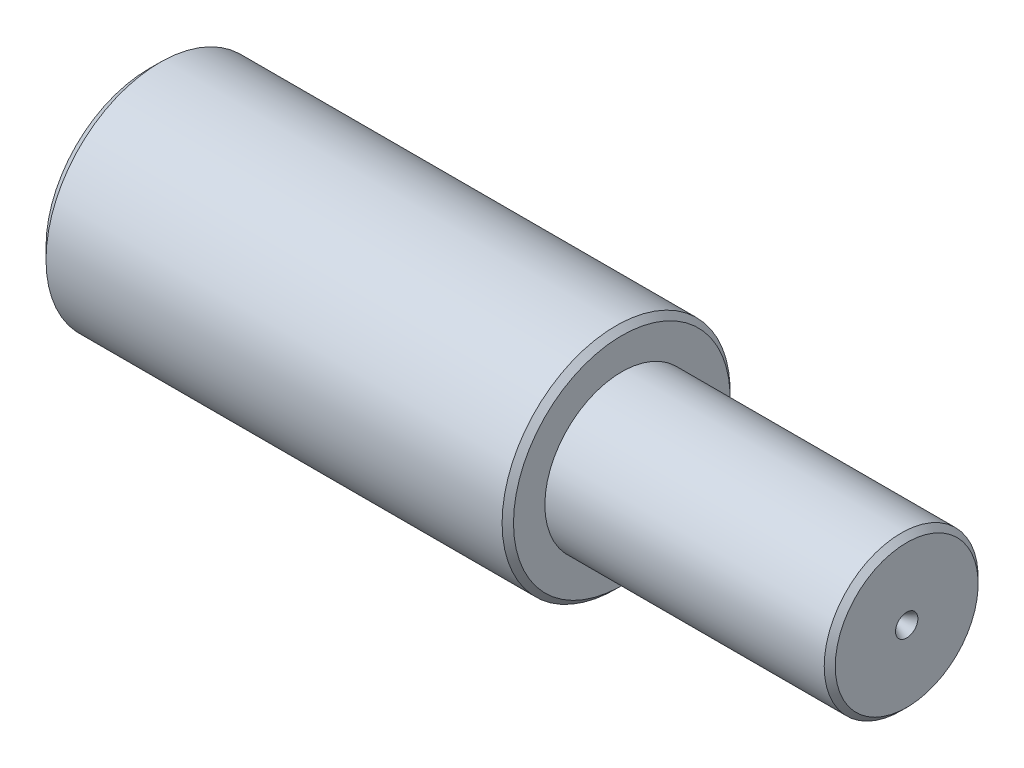
ISO-10303-21;
HEADER;
FILE_DESCRIPTION(('STEP AP214'),'2;1');
FILE_NAME('part.step','',(''),(''),'','','');
FILE_SCHEMA(('AUTOMOTIVE_DESIGN { 1 0 10303 214 1 1 1 1 }'));
ENDSEC;
DATA;
#1=APPLICATION_CONTEXT('core data for automotive mechanical design processes');
#2=APPLICATION_PROTOCOL_DEFINITION('international standard','automotive_design',2000,#1);
#3=PRODUCT_CONTEXT('',#1,'mechanical');
#4=PRODUCT('Part','Part','',(#3));
#5=PRODUCT_RELATED_PRODUCT_CATEGORY('part','',(#4));
#6=PRODUCT_DEFINITION_FORMATION('','',#4);
#7=PRODUCT_DEFINITION_CONTEXT('part definition',#1,'design');
#8=PRODUCT_DEFINITION('design','',#6,#7);
#9=PRODUCT_DEFINITION_SHAPE('','',#8);
#10=(LENGTH_UNIT() NAMED_UNIT(*) SI_UNIT(.MILLI.,.METRE.));
#11=(NAMED_UNIT(*) PLANE_ANGLE_UNIT() SI_UNIT($,.RADIAN.));
#12=(NAMED_UNIT(*) SI_UNIT($,.STERADIAN.) SOLID_ANGLE_UNIT());
#13=UNCERTAINTY_MEASURE_WITH_UNIT(LENGTH_MEASURE(1.E-05),#10,'distance_accuracy_value','');
#14=(GEOMETRIC_REPRESENTATION_CONTEXT(3) GLOBAL_UNCERTAINTY_ASSIGNED_CONTEXT((#13)) GLOBAL_UNIT_ASSIGNED_CONTEXT((#10,
#11,#12)) REPRESENTATION_CONTEXT('',''));
#15=CARTESIAN_POINT('',(0.,0.,0.));
#16=DIRECTION('',(0.,0.,1.));
#17=DIRECTION('',(1.,0.,0.));
#18=AXIS2_PLACEMENT_3D('',#15,#16,#17);
#19=CARTESIAN_POINT('',(-47.5274973026254,0.,-20.337527378994));
#20=DIRECTION('',(1.,0.,0.));
#21=DIRECTION('',(0.,0.,-1.));
#22=AXIS2_PLACEMENT_3D('',#19,#20,#21);
#23=PLANE('',#22);
#24=CARTESIAN_POINT('',(-47.5274973026254,0.,-2.337527378994));
#25=DIRECTION('',(-1.,0.,0.));
#26=DIRECTION('',(0.,0.,1.));
#27=AXIS2_PLACEMENT_3D('',#24,#25,#26);
#28=CIRCLE('',#27,18.);
#29=CARTESIAN_POINT('',(-47.5274973026254,0.,15.662472621006));
#30=VERTEX_POINT('',#29);
#31=EDGE_CURVE('E11',#30,#30,#28,.T.);
#32=ORIENTED_EDGE('',*,*,#31,.T.);
#33=EDGE_LOOP('',(#32));
#34=FACE_BOUND('',#33,.T.);
#35=ADVANCED_FACE('F35',(#34),#23,.F.);
#36=CARTESIAN_POINT('',(-45.5274973026254,0.,-2.337527378994));
#37=DIRECTION('',(1.,0.,0.));
#38=DIRECTION('',(0.,0.,-1.));
#39=AXIS2_PLACEMENT_3D('',#36,#37,#38);
#40=CONICAL_SURFACE('',#39,20.,0.78539816339745);
#41=ORIENTED_EDGE('',*,*,#31,.F.);
#42=EDGE_LOOP('',(#41));
#43=FACE_BOUND('',#42,.T.);
#44=CARTESIAN_POINT('',(-45.5274973026254,0.,-2.337527378994));
#45=DIRECTION('',(-1.,0.,0.));
#46=DIRECTION('',(0.,0.,1.));
#47=AXIS2_PLACEMENT_3D('',#44,#45,#46);
#48=CIRCLE('',#47,20.);
#49=CARTESIAN_POINT('',(-45.5274973026254,0.,17.662472621006));
#50=VERTEX_POINT('',#49);
#51=EDGE_CURVE('E41',#50,#50,#48,.T.);
#52=ORIENTED_EDGE('',*,*,#51,.T.);
#53=EDGE_LOOP('',(#52));
#54=FACE_BOUND('',#53,.T.);
#55=ADVANCED_FACE('F57',(#43,#54),#40,.T.);
#56=CARTESIAN_POINT('',(-58.6080417490214,0.,-2.337527378994));
#57=DIRECTION('',(-1.,0.,0.));
#58=DIRECTION('',(0.,0.,1.));
#59=AXIS2_PLACEMENT_3D('',#56,#57,#58);
#60=CYLINDRICAL_SURFACE('',#59,20.);
#61=ORIENTED_EDGE('',*,*,#51,.F.);
#62=EDGE_LOOP('',(#61));
#63=FACE_BOUND('',#62,.T.);
#64=CARTESIAN_POINT('',(34.4725026973746,0.,-2.337527378994));
#65=DIRECTION('',(-1.,0.,0.));
#66=DIRECTION('',(0.,0.,1.));
#67=AXIS2_PLACEMENT_3D('',#64,#65,#66);
#68=CIRCLE('',#67,20.);
#69=CARTESIAN_POINT('',(34.4725026973746,0.,17.662472621006));
#70=VERTEX_POINT('',#69);
#71=EDGE_CURVE('E69',#70,#70,#68,.T.);
#72=ORIENTED_EDGE('',*,*,#71,.T.);
#73=EDGE_LOOP('',(#72));
#74=FACE_BOUND('',#73,.T.);
#75=ADVANCED_FACE('F62',(#63,#74),#60,.T.);
#76=CARTESIAN_POINT('',(35.4725026973746,0.,-2.337527378994));
#77=DIRECTION('',(-1.,0.,0.));
#78=DIRECTION('',(0.,0.,1.));
#79=AXIS2_PLACEMENT_3D('',#76,#77,#78);
#80=CONICAL_SURFACE('',#79,19.,0.785398163397448);
#81=ORIENTED_EDGE('',*,*,#71,.F.);
#82=EDGE_LOOP('',(#81));
#83=FACE_BOUND('',#82,.T.);
#84=CARTESIAN_POINT('',(35.4725026973746,0.,-2.337527378994));
#85=DIRECTION('',(-1.,0.,0.));
#86=DIRECTION('',(0.,0.,1.));
#87=AXIS2_PLACEMENT_3D('',#84,#85,#86);
#88=CIRCLE('',#87,19.);
#89=CARTESIAN_POINT('',(35.4725026973746,0.,16.662472621006));
#90=VERTEX_POINT('',#89);
#91=EDGE_CURVE('E71',#90,#90,#88,.T.);
#92=ORIENTED_EDGE('',*,*,#91,.T.);
#93=EDGE_LOOP('',(#92));
#94=FACE_BOUND('',#93,.T.);
#95=ADVANCED_FACE('F104',(#83,#94),#80,.T.);
#96=CARTESIAN_POINT('',(35.4725026973746,0.,-21.337527378994));
#97=DIRECTION('',(-1.,0.,0.));
#98=DIRECTION('',(0.,0.,1.));
#99=AXIS2_PLACEMENT_3D('',#96,#97,#98);
#100=PLANE('',#99);
#101=ORIENTED_EDGE('',*,*,#91,.F.);
#102=EDGE_LOOP('',(#101));
#103=FACE_BOUND('',#102,.T.);
#104=CARTESIAN_POINT('',(35.4725026973746,0.,-2.337527378994));
#105=DIRECTION('',(-1.,0.,0.));
#106=DIRECTION('',(0.,0.,1.));
#107=AXIS2_PLACEMENT_3D('',#104,#105,#106);
#108=CIRCLE('',#107,13.5);
#109=CARTESIAN_POINT('',(35.4725026973746,0.,11.162472621006));
#110=VERTEX_POINT('',#109);
#111=EDGE_CURVE('E76',#110,#110,#108,.T.);
#112=ORIENTED_EDGE('',*,*,#111,.T.);
#113=EDGE_LOOP('',(#112));
#114=FACE_BOUND('',#113,.T.);
#115=ADVANCED_FACE('F97',(#103,#114),#100,.F.);
#116=CARTESIAN_POINT('',(-58.6080417490214,0.,-2.337527378994));
#117=DIRECTION('',(-1.,0.,0.));
#118=DIRECTION('',(0.,0.,1.));
#119=AXIS2_PLACEMENT_3D('',#116,#117,#118);
#120=CYLINDRICAL_SURFACE('',#119,13.5);
#121=ORIENTED_EDGE('',*,*,#111,.F.);
#122=EDGE_LOOP('',(#121));
#123=FACE_BOUND('',#122,.T.);
#124=CARTESIAN_POINT('',(84.4725026973746,0.,-2.337527378994));
#125=DIRECTION('',(-1.,0.,0.));
#126=DIRECTION('',(0.,0.,1.));
#127=AXIS2_PLACEMENT_3D('',#124,#125,#126);
#128=CIRCLE('',#127,13.5);
#129=CARTESIAN_POINT('',(84.4725026973746,0.,11.162472621006));
#130=VERTEX_POINT('',#129);
#131=EDGE_CURVE('E79',#130,#130,#128,.T.);
#132=ORIENTED_EDGE('',*,*,#131,.T.);
#133=EDGE_LOOP('',(#132));
#134=FACE_BOUND('',#133,.T.);
#135=ADVANCED_FACE('F91',(#123,#134),#120,.T.);
#136=CARTESIAN_POINT('',(85.4415583764698,0.,-2.337527378994));
#137=DIRECTION('',(-1.,0.,0.));
#138=DIRECTION('',(0.,0.,1.));
#139=AXIS2_PLACEMENT_3D('',#136,#137,#138);
#140=CONICAL_SURFACE('',#139,12.5309443209048,0.785398163397463);
#141=ORIENTED_EDGE('',*,*,#131,.F.);
#142=EDGE_LOOP('',(#141));
#143=FACE_BOUND('',#142,.T.);
#144=CARTESIAN_POINT('',(85.4415583764698,0.,-2.337527378994));
#145=DIRECTION('',(-1.,0.,0.));
#146=DIRECTION('',(0.,0.,1.));
#147=AXIS2_PLACEMENT_3D('',#144,#145,#146);
#148=CIRCLE('',#147,12.5309443209048);
#149=CARTESIAN_POINT('',(85.4415583764698,0.,10.1934169419108));
#150=VERTEX_POINT('',#149);
#151=EDGE_CURVE('E82',#150,#150,#148,.T.);
#152=ORIENTED_EDGE('',*,*,#151,.T.);
#153=EDGE_LOOP('',(#152));
#154=FACE_BOUND('',#153,.T.);
#155=ADVANCED_FACE('F52',(#143,#154),#140,.T.);
#156=CARTESIAN_POINT('',(85.4415583764698,0.,-14.8684716998988));
#157=DIRECTION('',(-1.,0.,0.));
#158=DIRECTION('',(0.,0.,1.));
#159=AXIS2_PLACEMENT_3D('',#156,#157,#158);
#160=PLANE('',#159);
#161=ORIENTED_EDGE('',*,*,#151,.F.);
#162=EDGE_LOOP('',(#161));
#163=FACE_BOUND('',#162,.T.);
#164=CARTESIAN_POINT('',(85.4415583764698,0.,-2.337527378994));
#165=DIRECTION('',(-1.,0.,0.));
#166=DIRECTION('',(0.,0.,1.));
#167=AXIS2_PLACEMENT_3D('',#164,#165,#166);
#168=CIRCLE('',#167,1.95889593673989);
#169=CARTESIAN_POINT('',(85.4415583764698,0.,-0.378631442254107));
#170=VERTEX_POINT('',#169);
#171=EDGE_CURVE('E85',#170,#170,#168,.T.);
#172=ORIENTED_EDGE('',*,*,#171,.T.);
#173=EDGE_LOOP('',(#172));
#174=FACE_BOUND('',#173,.T.);
#175=ADVANCED_FACE('F46',(#163,#174),#160,.F.);
#176=CARTESIAN_POINT('',(82.259183131536,0.,-2.337527378994));
#177=DIRECTION('',(1.,0.,0.));
#178=DIRECTION('',(0.,0.,-1.));
#179=AXIS2_PLACEMENT_3D('',#176,#177,#178);
#180=CONICAL_SURFACE('',#179,0.,0.551771479369417);
#181=ORIENTED_EDGE('',*,*,#171,.F.);
#182=EDGE_LOOP('',(#181));
#183=FACE_BOUND('',#182,.T.);
#184=CARTESIAN_POINT('',(82.259183131536,0.,-2.337527378994));
#185=VERTEX_POINT('',#184);
#186=VERTEX_LOOP('',#185);
#187=FACE_BOUND('',#186,.T.);
#188=ADVANCED_FACE('F44',(#183,#187),#180,.F.);
#189=CLOSED_SHELL('',(#35,#55,#75,#95,#115,#135,#155,#175,#188));
#190=MANIFOLD_SOLID_BREP('B2',#189);
#191=ADVANCED_BREP_SHAPE_REPRESENTATION('',(#18,#190),#14);
#192=SHAPE_DEFINITION_REPRESENTATION(#9,#191);
ENDSEC;
END-ISO-10303-21;
